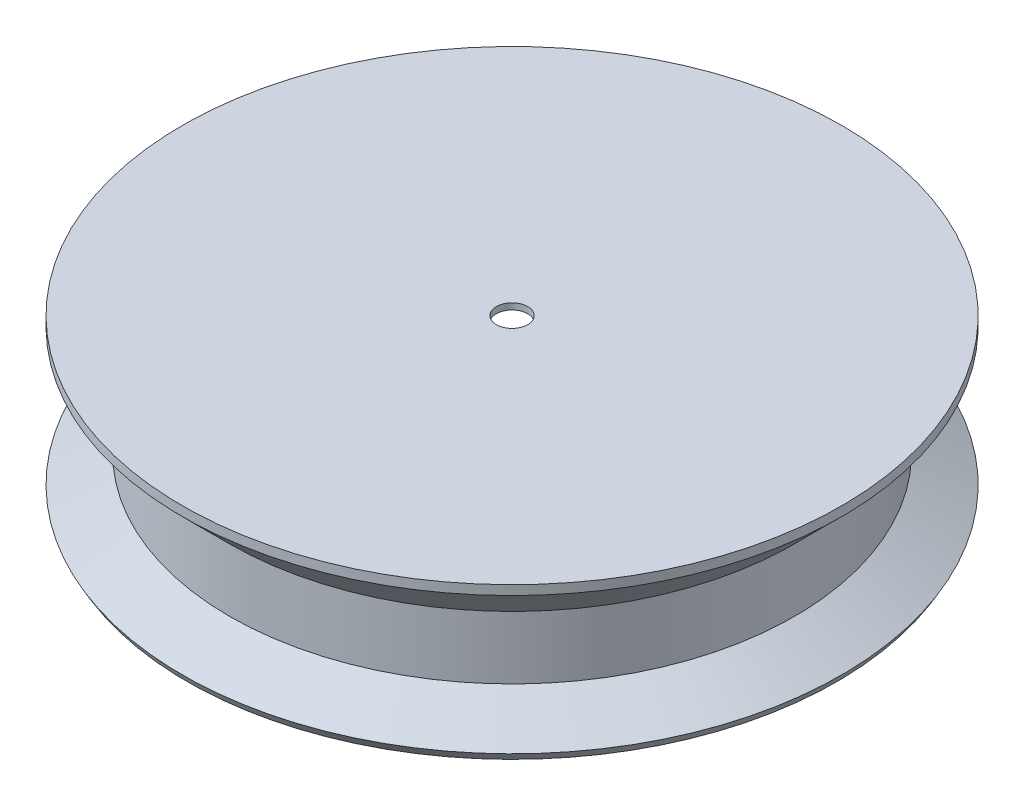
ISO-10303-21;
HEADER;
FILE_DESCRIPTION(('STEP AP214'),'2;1');
FILE_NAME('part.step','',(''),(''),'','','');
FILE_SCHEMA(('AUTOMOTIVE_DESIGN { 1 0 10303 214 1 1 1 1 }'));
ENDSEC;
DATA;
#1=APPLICATION_CONTEXT('core data for automotive mechanical design processes');
#2=APPLICATION_PROTOCOL_DEFINITION('international standard','automotive_design',2000,#1);
#3=PRODUCT_CONTEXT('',#1,'mechanical');
#4=PRODUCT('Part','Part','',(#3));
#5=PRODUCT_RELATED_PRODUCT_CATEGORY('part','',(#4));
#6=PRODUCT_DEFINITION_FORMATION('','',#4);
#7=PRODUCT_DEFINITION_CONTEXT('part definition',#1,'design');
#8=PRODUCT_DEFINITION('design','',#6,#7);
#9=PRODUCT_DEFINITION_SHAPE('','',#8);
#10=(LENGTH_UNIT() NAMED_UNIT(*) SI_UNIT(.MILLI.,.METRE.));
#11=(NAMED_UNIT(*) PLANE_ANGLE_UNIT() SI_UNIT($,.RADIAN.));
#12=(NAMED_UNIT(*) SI_UNIT($,.STERADIAN.) SOLID_ANGLE_UNIT());
#13=UNCERTAINTY_MEASURE_WITH_UNIT(LENGTH_MEASURE(1.E-05),#10,'distance_accuracy_value','');
#14=(GEOMETRIC_REPRESENTATION_CONTEXT(3) GLOBAL_UNCERTAINTY_ASSIGNED_CONTEXT((#13)) GLOBAL_UNIT_ASSIGNED_CONTEXT((#10,
#11,#12)) REPRESENTATION_CONTEXT('',''));
#15=CARTESIAN_POINT('',(0.,0.,0.));
#16=DIRECTION('',(0.,0.,1.));
#17=DIRECTION('',(1.,0.,0.));
#18=AXIS2_PLACEMENT_3D('',#15,#16,#17);
#19=CARTESIAN_POINT('',(0.,-51.7379843994964,0.));
#20=DIRECTION('',(0.,-1.,0.));
#21=DIRECTION('',(0.,0.,-1.));
#22=AXIS2_PLACEMENT_3D('',#19,#20,#21);
#23=CYLINDRICAL_SURFACE('',#22,5.);
#24=CARTESIAN_POINT('',(0.,0.,0.));
#25=DIRECTION('',(0.,-1.,0.));
#26=DIRECTION('',(0.,0.,-1.));
#27=AXIS2_PLACEMENT_3D('',#24,#25,#26);
#28=CIRCLE('',#27,5.);
#29=CARTESIAN_POINT('',(0.,0.,-5.));
#30=VERTEX_POINT('',#29);
#31=EDGE_CURVE('E10',#30,#30,#28,.T.);
#32=ORIENTED_EDGE('',*,*,#31,.F.);
#33=EDGE_LOOP('',(#32));
#34=FACE_BOUND('',#33,.T.);
#35=CARTESIAN_POINT('',(0.,-2.,0.));
#36=DIRECTION('',(0.,-1.,0.));
#37=DIRECTION('',(0.,0.,-1.));
#38=AXIS2_PLACEMENT_3D('',#35,#36,#37);
#39=CIRCLE('',#38,5.);
#40=CARTESIAN_POINT('',(0.,-2.,-5.));
#41=VERTEX_POINT('',#40);
#42=EDGE_CURVE('E77',#41,#41,#39,.T.);
#43=ORIENTED_EDGE('',*,*,#42,.T.);
#44=EDGE_LOOP('',(#43));
#45=FACE_BOUND('',#44,.T.);
#46=ADVANCED_FACE('F31',(#34,#45),#23,.F.);
#47=CARTESIAN_POINT('',(-5.,0.,0.));
#48=DIRECTION('',(0.,-1.,0.));
#49=DIRECTION('',(0.,0.,-1.));
#50=AXIS2_PLACEMENT_3D('',#47,#48,#49);
#51=PLANE('',#50);
#52=CARTESIAN_POINT('',(0.,0.,0.));
#53=DIRECTION('',(0.,-1.,0.));
#54=DIRECTION('',(0.,0.,-1.));
#55=AXIS2_PLACEMENT_3D('',#52,#53,#54);
#56=CIRCLE('',#55,105.);
#57=CARTESIAN_POINT('',(0.,0.,-105.));
#58=VERTEX_POINT('',#57);
#59=EDGE_CURVE('E37',#58,#58,#56,.T.);
#60=ORIENTED_EDGE('',*,*,#59,.F.);
#61=EDGE_LOOP('',(#60));
#62=FACE_BOUND('',#61,.T.);
#63=ORIENTED_EDGE('',*,*,#31,.T.);
#64=EDGE_LOOP('',(#63));
#65=FACE_BOUND('',#64,.T.);
#66=ADVANCED_FACE('F150',(#62,#65),#51,.F.);
#67=CARTESIAN_POINT('',(0.,-51.7379843994964,0.));
#68=DIRECTION('',(0.,-1.,0.));
#69=DIRECTION('',(0.,0.,-1.));
#70=AXIS2_PLACEMENT_3D('',#67,#68,#69);
#71=CYLINDRICAL_SURFACE('',#70,105.);
#72=CARTESIAN_POINT('',(0.,-3.00000000000001,0.));
#73=DIRECTION('',(0.,-1.,0.));
#74=DIRECTION('',(0.,0.,-1.));
#75=AXIS2_PLACEMENT_3D('',#72,#73,#74);
#76=CIRCLE('',#75,105.);
#77=CARTESIAN_POINT('',(0.,-3.00000000000001,-105.));
#78=VERTEX_POINT('',#77);
#79=EDGE_CURVE('E41',#78,#78,#76,.T.);
#80=ORIENTED_EDGE('',*,*,#79,.F.);
#81=EDGE_LOOP('',(#80));
#82=FACE_BOUND('',#81,.T.);
#83=ORIENTED_EDGE('',*,*,#59,.T.);
#84=EDGE_LOOP('',(#83));
#85=FACE_BOUND('',#84,.T.);
#86=ADVANCED_FACE('F145',(#82,#85),#71,.T.);
#87=CARTESIAN_POINT('',(0.,-3.00000000000001,0.));
#88=DIRECTION('',(0.,1.,0.));
#89=DIRECTION('',(0.,0.,1.));
#90=AXIS2_PLACEMENT_3D('',#87,#88,#89);
#91=CONICAL_SURFACE('',#90,105.,0.785398163397451);
#92=CARTESIAN_POINT('',(0.,-17.9999999999999,0.));
#93=DIRECTION('',(0.,-1.,0.));
#94=DIRECTION('',(0.,0.,-1.));
#95=AXIS2_PLACEMENT_3D('',#92,#93,#94);
#96=CIRCLE('',#95,90.);
#97=CARTESIAN_POINT('',(0.,-17.9999999999999,-90.));
#98=VERTEX_POINT('',#97);
#99=EDGE_CURVE('E45',#98,#98,#96,.T.);
#100=ORIENTED_EDGE('',*,*,#99,.F.);
#101=EDGE_LOOP('',(#100));
#102=FACE_BOUND('',#101,.T.);
#103=ORIENTED_EDGE('',*,*,#79,.T.);
#104=EDGE_LOOP('',(#103));
#105=FACE_BOUND('',#104,.T.);
#106=ADVANCED_FACE('F139',(#102,#105),#91,.T.);
#107=CARTESIAN_POINT('',(0.,-51.7379843994964,0.));
#108=DIRECTION('',(0.,-1.,0.));
#109=DIRECTION('',(0.,0.,-1.));
#110=AXIS2_PLACEMENT_3D('',#107,#108,#109);
#111=CYLINDRICAL_SURFACE('',#110,90.);
#112=CARTESIAN_POINT('',(0.,-37.9999999999999,0.));
#113=DIRECTION('',(0.,-1.,0.));
#114=DIRECTION('',(0.,0.,-1.));
#115=AXIS2_PLACEMENT_3D('',#112,#113,#114);
#116=CIRCLE('',#115,90.);
#117=CARTESIAN_POINT('',(0.,-37.9999999999999,-90.));
#118=VERTEX_POINT('',#117);
#119=EDGE_CURVE('E50',#118,#118,#116,.T.);
#120=ORIENTED_EDGE('',*,*,#119,.F.);
#121=EDGE_LOOP('',(#120));
#122=FACE_BOUND('',#121,.T.);
#123=ORIENTED_EDGE('',*,*,#99,.T.);
#124=EDGE_LOOP('',(#123));
#125=FACE_BOUND('',#124,.T.);
#126=ADVANCED_FACE('F133',(#122,#125),#111,.T.);
#127=CARTESIAN_POINT('',(0.,-37.9999999999999,0.));
#128=DIRECTION('',(0.,-1.,0.));
#129=DIRECTION('',(0.,0.,-1.));
#130=AXIS2_PLACEMENT_3D('',#127,#128,#129);
#131=CONICAL_SURFACE('',#130,90.,1.0471975511966);
#132=CARTESIAN_POINT('',(0.,-46.6602540378442,0.));
#133=DIRECTION('',(0.,-1.,0.));
#134=DIRECTION('',(0.,0.,-1.));
#135=AXIS2_PLACEMENT_3D('',#132,#133,#134);
#136=CIRCLE('',#135,105.);
#137=CARTESIAN_POINT('',(0.,-46.6602540378442,-105.));
#138=VERTEX_POINT('',#137);
#139=EDGE_CURVE('E53',#138,#138,#136,.T.);
#140=ORIENTED_EDGE('',*,*,#139,.F.);
#141=EDGE_LOOP('',(#140));
#142=FACE_BOUND('',#141,.T.);
#143=ORIENTED_EDGE('',*,*,#119,.T.);
#144=EDGE_LOOP('',(#143));
#145=FACE_BOUND('',#144,.T.);
#146=ADVANCED_FACE('F127',(#142,#145),#131,.T.);
#147=CARTESIAN_POINT('',(0.,-46.6602540378442,0.));
#148=DIRECTION('',(0.,1.,0.));
#149=DIRECTION('',(0.,0.,1.));
#150=AXIS2_PLACEMENT_3D('',#147,#148,#149);
#151=CONICAL_SURFACE('',#150,105.,0.523598775598295);
#152=CARTESIAN_POINT('',(0.,-49.2742708566632,0.));
#153=DIRECTION('',(0.,-1.,0.));
#154=DIRECTION('',(0.,0.,-1.));
#155=AXIS2_PLACEMENT_3D('',#152,#153,#154);
#156=CIRCLE('',#155,103.490796685989);
#157=CARTESIAN_POINT('',(0.,-49.2742708566632,-103.490796685989));
#158=VERTEX_POINT('',#157);
#159=EDGE_CURVE('E56',#158,#158,#156,.T.);
#160=ORIENTED_EDGE('',*,*,#159,.F.);
#161=EDGE_LOOP('',(#160));
#162=FACE_BOUND('',#161,.T.);
#163=ORIENTED_EDGE('',*,*,#139,.T.);
#164=EDGE_LOOP('',(#163));
#165=FACE_BOUND('',#164,.T.);
#166=ADVANCED_FACE('F121',(#162,#165),#151,.T.);
#167=CARTESIAN_POINT('',(-103.490796685989,-49.2742708566632,0.));
#168=DIRECTION('',(0.,1.,0.));
#169=DIRECTION('',(0.,0.,1.));
#170=AXIS2_PLACEMENT_3D('',#167,#168,#169);
#171=PLANE('',#170);
#172=CARTESIAN_POINT('',(0.,-49.2742708566632,0.));
#173=DIRECTION('',(0.,-1.,0.));
#174=DIRECTION('',(0.,0.,-1.));
#175=AXIS2_PLACEMENT_3D('',#172,#173,#174);
#176=CIRCLE('',#175,80.);
#177=CARTESIAN_POINT('',(0.,-49.2742708566632,-80.));
#178=VERTEX_POINT('',#177);
#179=EDGE_CURVE('E59',#178,#178,#176,.T.);
#180=ORIENTED_EDGE('',*,*,#179,.F.);
#181=EDGE_LOOP('',(#180));
#182=FACE_BOUND('',#181,.T.);
#183=ORIENTED_EDGE('',*,*,#159,.T.);
#184=EDGE_LOOP('',(#183));
#185=FACE_BOUND('',#184,.T.);
#186=ADVANCED_FACE('F115',(#182,#185),#171,.F.);
#187=CARTESIAN_POINT('',(0.,-51.7379843994964,0.));
#188=DIRECTION('',(0.,-1.,0.));
#189=DIRECTION('',(0.,0.,-1.));
#190=AXIS2_PLACEMENT_3D('',#187,#188,#189);
#191=CYLINDRICAL_SURFACE('',#190,80.);
#192=CARTESIAN_POINT('',(0.,-47.2742708566632,0.));
#193=DIRECTION('',(0.,-1.,0.));
#194=DIRECTION('',(0.,0.,-1.));
#195=AXIS2_PLACEMENT_3D('',#192,#193,#194);
#196=CIRCLE('',#195,80.);
#197=CARTESIAN_POINT('',(0.,-47.2742708566632,-80.));
#198=VERTEX_POINT('',#197);
#199=EDGE_CURVE('E62',#198,#198,#196,.T.);
#200=ORIENTED_EDGE('',*,*,#199,.F.);
#201=EDGE_LOOP('',(#200));
#202=FACE_BOUND('',#201,.T.);
#203=ORIENTED_EDGE('',*,*,#179,.T.);
#204=EDGE_LOOP('',(#203));
#205=FACE_BOUND('',#204,.T.);
#206=ADVANCED_FACE('F109',(#202,#205),#191,.F.);
#207=CARTESIAN_POINT('',(-80.,-47.2742708566632,0.));
#208=DIRECTION('',(0.,-1.,0.));
#209=DIRECTION('',(0.,0.,-1.));
#210=AXIS2_PLACEMENT_3D('',#207,#208,#209);
#211=PLANE('',#210);
#212=CARTESIAN_POINT('',(0.,-47.2742708566632,0.));
#213=DIRECTION('',(0.,-1.,0.));
#214=DIRECTION('',(0.,0.,-1.));
#215=AXIS2_PLACEMENT_3D('',#212,#213,#214);
#216=CIRCLE('',#215,102.063508326896);
#217=CARTESIAN_POINT('',(0.,-47.2742708566632,-102.063508326896));
#218=VERTEX_POINT('',#217);
#219=EDGE_CURVE('E65',#218,#218,#216,.T.);
#220=ORIENTED_EDGE('',*,*,#219,.F.);
#221=EDGE_LOOP('',(#220));
#222=FACE_BOUND('',#221,.T.);
#223=ORIENTED_EDGE('',*,*,#199,.T.);
#224=EDGE_LOOP('',(#223));
#225=FACE_BOUND('',#224,.T.);
#226=ADVANCED_FACE('F103',(#222,#225),#211,.F.);
#227=CARTESIAN_POINT('',(0.,-47.2742708566632,0.));
#228=DIRECTION('',(0.,-1.,0.));
#229=DIRECTION('',(0.,0.,-1.));
#230=AXIS2_PLACEMENT_3D('',#227,#228,#229);
#231=CONICAL_SURFACE('',#230,102.063508326896,1.0471975511966);
#232=CARTESIAN_POINT('',(0.,-39.1547005383791,0.));
#233=DIRECTION('',(0.,-1.,0.));
#234=DIRECTION('',(0.,0.,-1.));
#235=AXIS2_PLACEMENT_3D('',#232,#233,#234);
#236=CIRCLE('',#235,88.);
#237=CARTESIAN_POINT('',(0.,-39.1547005383791,-88.));
#238=VERTEX_POINT('',#237);
#239=EDGE_CURVE('E68',#238,#238,#236,.T.);
#240=ORIENTED_EDGE('',*,*,#239,.F.);
#241=EDGE_LOOP('',(#240));
#242=FACE_BOUND('',#241,.T.);
#243=ORIENTED_EDGE('',*,*,#219,.T.);
#244=EDGE_LOOP('',(#243));
#245=FACE_BOUND('',#244,.T.);
#246=ADVANCED_FACE('F97',(#242,#245),#231,.F.);
#247=CARTESIAN_POINT('',(0.,-51.7379843994964,0.));
#248=DIRECTION('',(0.,-1.,0.));
#249=DIRECTION('',(0.,0.,-1.));
#250=AXIS2_PLACEMENT_3D('',#247,#248,#249);
#251=CYLINDRICAL_SURFACE('',#250,88.);
#252=CARTESIAN_POINT('',(0.,-17.1715728752537,0.));
#253=DIRECTION('',(0.,-1.,0.));
#254=DIRECTION('',(0.,0.,-1.));
#255=AXIS2_PLACEMENT_3D('',#252,#253,#254);
#256=CIRCLE('',#255,88.);
#257=CARTESIAN_POINT('',(0.,-17.1715728752537,-88.));
#258=VERTEX_POINT('',#257);
#259=EDGE_CURVE('E71',#258,#258,#256,.T.);
#260=ORIENTED_EDGE('',*,*,#259,.F.);
#261=EDGE_LOOP('',(#260));
#262=FACE_BOUND('',#261,.T.);
#263=ORIENTED_EDGE('',*,*,#239,.T.);
#264=EDGE_LOOP('',(#263));
#265=FACE_BOUND('',#264,.T.);
#266=ADVANCED_FACE('F91',(#262,#265),#251,.F.);
#267=CARTESIAN_POINT('',(0.,-17.1715728752537,0.));
#268=DIRECTION('',(0.,1.,0.));
#269=DIRECTION('',(0.,0.,1.));
#270=AXIS2_PLACEMENT_3D('',#267,#268,#269);
#271=CONICAL_SURFACE('',#270,88.,0.779711650910744);
#272=CARTESIAN_POINT('',(0.,-2.,0.));
#273=DIRECTION('',(0.,-1.,0.));
#274=DIRECTION('',(0.,0.,-1.));
#275=AXIS2_PLACEMENT_3D('',#272,#273,#274);
#276=CIRCLE('',#275,103.);
#277=CARTESIAN_POINT('',(0.,-2.,-103.));
#278=VERTEX_POINT('',#277);
#279=EDGE_CURVE('E74',#278,#278,#276,.T.);
#280=ORIENTED_EDGE('',*,*,#279,.F.);
#281=EDGE_LOOP('',(#280));
#282=FACE_BOUND('',#281,.T.);
#283=ORIENTED_EDGE('',*,*,#259,.T.);
#284=EDGE_LOOP('',(#283));
#285=FACE_BOUND('',#284,.T.);
#286=ADVANCED_FACE('F85',(#282,#285),#271,.F.);
#287=CARTESIAN_POINT('',(-103.,-2.,0.));
#288=DIRECTION('',(0.,1.,0.));
#289=DIRECTION('',(0.,0.,1.));
#290=AXIS2_PLACEMENT_3D('',#287,#288,#289);
#291=PLANE('',#290);
#292=ORIENTED_EDGE('',*,*,#42,.F.);
#293=EDGE_LOOP('',(#292));
#294=FACE_BOUND('',#293,.T.);
#295=ORIENTED_EDGE('',*,*,#279,.T.);
#296=EDGE_LOOP('',(#295));
#297=FACE_BOUND('',#296,.T.);
#298=ADVANCED_FACE('F82',(#294,#297),#291,.F.);
#299=CLOSED_SHELL('',(#46,#66,#86,#106,#126,#146,#166,#186,#206,#226,#246,#266,#286,#298));
#300=MANIFOLD_SOLID_BREP('B2',#299);
#301=ADVANCED_BREP_SHAPE_REPRESENTATION('',(#18,#300),#14);
#302=SHAPE_DEFINITION_REPRESENTATION(#9,#301);
ENDSEC;
END-ISO-10303-21;
